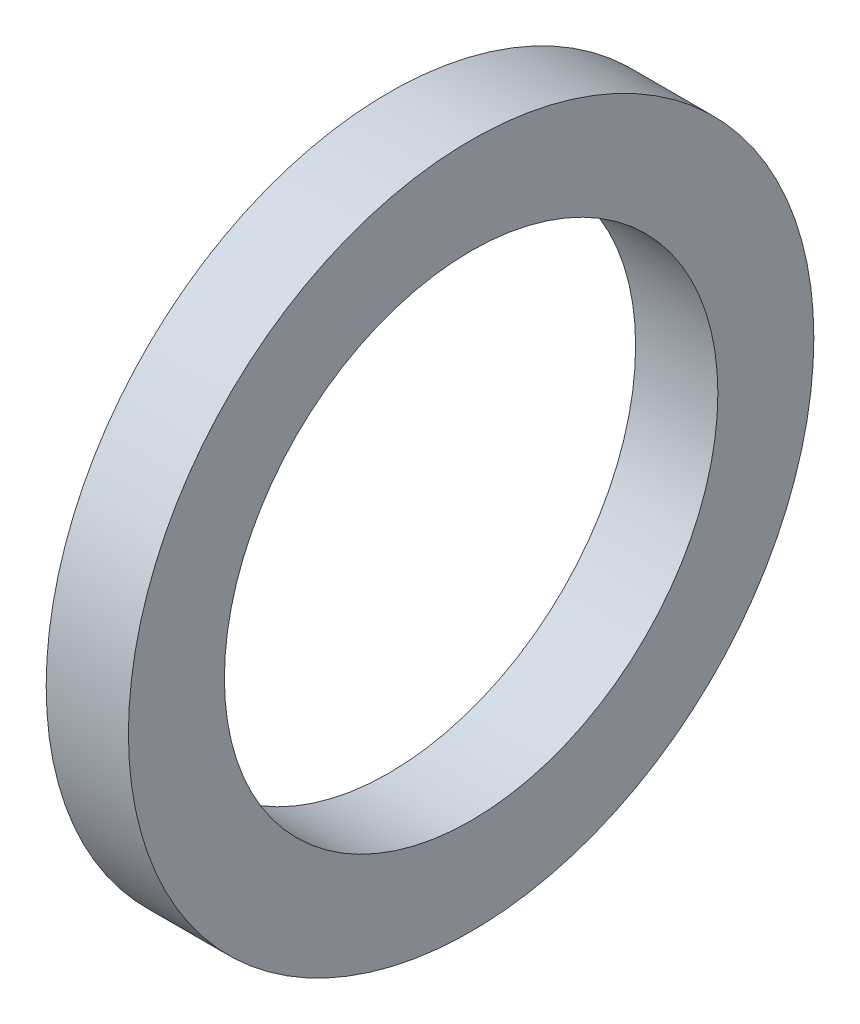
ISO-10303-21;
HEADER;
FILE_DESCRIPTION(('STEP AP214'),'2;1');
FILE_NAME('part.step','',(''),(''),'','','');
FILE_SCHEMA(('AUTOMOTIVE_DESIGN { 1 0 10303 214 1 1 1 1 }'));
ENDSEC;
DATA;
#1=APPLICATION_CONTEXT('core data for automotive mechanical design processes');
#2=APPLICATION_PROTOCOL_DEFINITION('international standard','automotive_design',2000,#1);
#3=PRODUCT_CONTEXT('',#1,'mechanical');
#4=PRODUCT('Part','Part','',(#3));
#5=PRODUCT_RELATED_PRODUCT_CATEGORY('part','',(#4));
#6=PRODUCT_DEFINITION_FORMATION('','',#4);
#7=PRODUCT_DEFINITION_CONTEXT('part definition',#1,'design');
#8=PRODUCT_DEFINITION('design','',#6,#7);
#9=PRODUCT_DEFINITION_SHAPE('','',#8);
#10=(LENGTH_UNIT() NAMED_UNIT(*) SI_UNIT(.MILLI.,.METRE.));
#11=(NAMED_UNIT(*) PLANE_ANGLE_UNIT() SI_UNIT($,.RADIAN.));
#12=(NAMED_UNIT(*) SI_UNIT($,.STERADIAN.) SOLID_ANGLE_UNIT());
#13=UNCERTAINTY_MEASURE_WITH_UNIT(LENGTH_MEASURE(1.E-05),#10,'distance_accuracy_value','');
#14=(GEOMETRIC_REPRESENTATION_CONTEXT(3) GLOBAL_UNCERTAINTY_ASSIGNED_CONTEXT((#13)) GLOBAL_UNIT_ASSIGNED_CONTEXT((#10,
#11,#12)) REPRESENTATION_CONTEXT('',''));
#15=CARTESIAN_POINT('',(0.,0.,0.));
#16=DIRECTION('',(0.,0.,1.));
#17=DIRECTION('',(1.,0.,0.));
#18=AXIS2_PLACEMENT_3D('',#15,#16,#17);
#19=CARTESIAN_POINT('',(-34.9249999999999,0.,0.));
#20=DIRECTION('',(-1.,0.,0.));
#21=DIRECTION('',(0.,0.,1.));
#22=AXIS2_PLACEMENT_3D('',#19,#20,#21);
#23=CYLINDRICAL_SURFACE('',#22,18.);
#24=CARTESIAN_POINT('',(0.,0.,0.));
#25=DIRECTION('',(-1.,0.,0.));
#26=DIRECTION('',(0.,0.,1.));
#27=AXIS2_PLACEMENT_3D('',#24,#25,#26);
#28=CIRCLE('',#27,18.);
#29=CARTESIAN_POINT('',(0.,0.,18.));
#30=VERTEX_POINT('',#29);
#31=EDGE_CURVE('E10',#30,#30,#28,.T.);
#32=ORIENTED_EDGE('',*,*,#31,.F.);
#33=EDGE_LOOP('',(#32));
#34=FACE_BOUND('',#33,.T.);
#35=CARTESIAN_POINT('',(-6.,0.,0.));
#36=DIRECTION('',(-1.,0.,0.));
#37=DIRECTION('',(0.,0.,1.));
#38=AXIS2_PLACEMENT_3D('',#35,#36,#37);
#39=CIRCLE('',#38,18.);
#40=CARTESIAN_POINT('',(-6.,0.,18.));
#41=VERTEX_POINT('',#40);
#42=EDGE_CURVE('E44',#41,#41,#39,.T.);
#43=ORIENTED_EDGE('',*,*,#42,.T.);
#44=EDGE_LOOP('',(#43));
#45=FACE_BOUND('',#44,.T.);
#46=ADVANCED_FACE('F30',(#34,#45),#23,.F.);
#47=CARTESIAN_POINT('',(0.,18.,0.));
#48=DIRECTION('',(-1.,0.,0.));
#49=DIRECTION('',(0.,0.,1.));
#50=AXIS2_PLACEMENT_3D('',#47,#48,#49);
#51=PLANE('',#50);
#52=CARTESIAN_POINT('',(0.,0.,0.));
#53=DIRECTION('',(-1.,0.,0.));
#54=DIRECTION('',(0.,0.,1.));
#55=AXIS2_PLACEMENT_3D('',#52,#53,#54);
#56=CIRCLE('',#55,25.);
#57=CARTESIAN_POINT('',(0.,0.,25.));
#58=VERTEX_POINT('',#57);
#59=EDGE_CURVE('E36',#58,#58,#56,.T.);
#60=ORIENTED_EDGE('',*,*,#59,.F.);
#61=EDGE_LOOP('',(#60));
#62=FACE_BOUND('',#61,.T.);
#63=ORIENTED_EDGE('',*,*,#31,.T.);
#64=EDGE_LOOP('',(#63));
#65=FACE_BOUND('',#64,.T.);
#66=ADVANCED_FACE('F59',(#62,#65),#51,.F.);
#67=CARTESIAN_POINT('',(-34.9249999999999,0.,0.));
#68=DIRECTION('',(-1.,0.,0.));
#69=DIRECTION('',(0.,0.,1.));
#70=AXIS2_PLACEMENT_3D('',#67,#68,#69);
#71=CYLINDRICAL_SURFACE('',#70,25.);
#72=CARTESIAN_POINT('',(-6.,0.,0.));
#73=DIRECTION('',(-1.,0.,0.));
#74=DIRECTION('',(0.,0.,1.));
#75=AXIS2_PLACEMENT_3D('',#72,#73,#74);
#76=CIRCLE('',#75,25.);
#77=CARTESIAN_POINT('',(-6.,0.,25.));
#78=VERTEX_POINT('',#77);
#79=EDGE_CURVE('E40',#78,#78,#76,.T.);
#80=ORIENTED_EDGE('',*,*,#79,.F.);
#81=EDGE_LOOP('',(#80));
#82=FACE_BOUND('',#81,.T.);
#83=ORIENTED_EDGE('',*,*,#59,.T.);
#84=EDGE_LOOP('',(#83));
#85=FACE_BOUND('',#84,.T.);
#86=ADVANCED_FACE('F54',(#82,#85),#71,.T.);
#87=CARTESIAN_POINT('',(-6.,25.,0.));
#88=DIRECTION('',(1.,0.,0.));
#89=DIRECTION('',(0.,0.,-1.));
#90=AXIS2_PLACEMENT_3D('',#87,#88,#89);
#91=PLANE('',#90);
#92=ORIENTED_EDGE('',*,*,#42,.F.);
#93=EDGE_LOOP('',(#92));
#94=FACE_BOUND('',#93,.T.);
#95=ORIENTED_EDGE('',*,*,#79,.T.);
#96=EDGE_LOOP('',(#95));
#97=FACE_BOUND('',#96,.T.);
#98=ADVANCED_FACE('F51',(#94,#97),#91,.F.);
#99=CLOSED_SHELL('',(#46,#66,#86,#98));
#100=MANIFOLD_SOLID_BREP('B2',#99);
#101=ADVANCED_BREP_SHAPE_REPRESENTATION('',(#18,#100),#14);
#102=SHAPE_DEFINITION_REPRESENTATION(#9,#101);
ENDSEC;
END-ISO-10303-21;
